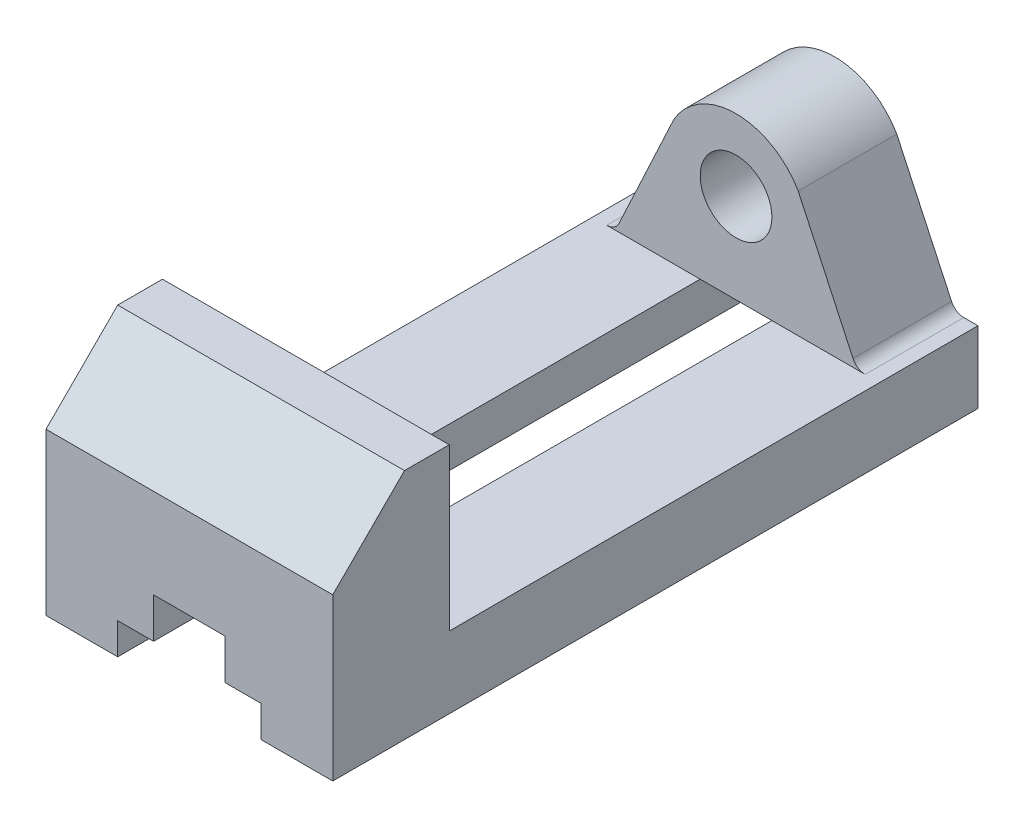
ISO-10303-21;
HEADER;
FILE_DESCRIPTION(('STEP AP214'),'2;1');
FILE_NAME('part.step','',(''),(''),'','','');
FILE_SCHEMA(('AUTOMOTIVE_DESIGN { 1 0 10303 214 1 1 1 1 }'));
ENDSEC;
DATA;
#1=APPLICATION_CONTEXT('core data for automotive mechanical design processes');
#2=APPLICATION_PROTOCOL_DEFINITION('international standard','automotive_design',2000,#1);
#3=PRODUCT_CONTEXT('',#1,'mechanical');
#4=PRODUCT('Part','Part','',(#3));
#5=PRODUCT_RELATED_PRODUCT_CATEGORY('part','',(#4));
#6=PRODUCT_DEFINITION_FORMATION('','',#4);
#7=PRODUCT_DEFINITION_CONTEXT('part definition',#1,'design');
#8=PRODUCT_DEFINITION('design','',#6,#7);
#9=PRODUCT_DEFINITION_SHAPE('','',#8);
#10=(LENGTH_UNIT() NAMED_UNIT(*) SI_UNIT(.MILLI.,.METRE.));
#11=(NAMED_UNIT(*) PLANE_ANGLE_UNIT() SI_UNIT($,.RADIAN.));
#12=(NAMED_UNIT(*) SI_UNIT($,.STERADIAN.) SOLID_ANGLE_UNIT());
#13=UNCERTAINTY_MEASURE_WITH_UNIT(LENGTH_MEASURE(1.E-05),#10,'distance_accuracy_value','');
#14=(GEOMETRIC_REPRESENTATION_CONTEXT(3) GLOBAL_UNCERTAINTY_ASSIGNED_CONTEXT((#13)) GLOBAL_UNIT_ASSIGNED_CONTEXT((#10,
#11,#12)) REPRESENTATION_CONTEXT('',''));
#15=CARTESIAN_POINT('',(0.,0.,0.));
#16=DIRECTION('',(0.,0.,1.));
#17=DIRECTION('',(1.,0.,0.));
#18=AXIS2_PLACEMENT_3D('',#15,#16,#17);
#19=CARTESIAN_POINT('',(32.,16.,0.));
#20=DIRECTION('',(0.,-1.,0.));
#21=DIRECTION('',(0.,0.,-1.));
#22=AXIS2_PLACEMENT_3D('',#19,#20,#21);
#23=PLANE('',#22);
#24=DIRECTION('',(-1.,0.,0.));
#25=VECTOR('',#24,1.);
#26=CARTESIAN_POINT('',(32.,16.,0.));
#27=LINE('',#26,#25);
#28=CARTESIAN_POINT('',(32.,16.,0.));
#29=VERTEX_POINT('',#28);
#30=CARTESIAN_POINT('',(28.8269173255336,16.,1.11022302462516E-13));
#31=VERTEX_POINT('',#30);
#32=EDGE_CURVE('E469',#29,#31,#27,.T.);
#33=ORIENTED_EDGE('',*,*,#32,.T.);
#34=DIRECTION('',(0.,0.,-1.));
#35=VECTOR('',#34,1.);
#36=CARTESIAN_POINT('',(28.8269173255336,16.,22.));
#37=LINE('',#36,#35);
#38=CARTESIAN_POINT('',(28.8269173255336,16.,22.));
#39=VERTEX_POINT('',#38);
#40=EDGE_CURVE('E489',#31,#39,#37,.F.);
#41=ORIENTED_EDGE('',*,*,#40,.T.);
#42=DIRECTION('',(1.,0.,0.));
#43=VECTOR('',#42,1.);
#44=CARTESIAN_POINT('',(26.9157065431111,16.,22.));
#45=LINE('',#44,#43);
#46=CARTESIAN_POINT('',(8.00000000000001,16.,22.));
#47=VERTEX_POINT('',#46);
#48=EDGE_CURVE('E64',#47,#39,#45,.T.);
#49=ORIENTED_EDGE('',*,*,#48,.F.);
#50=DIRECTION('',(0.,0.,-1.));
#51=VECTOR('',#50,1.);
#52=CARTESIAN_POINT('',(7.99999999999979,16.,144.));
#53=LINE('',#52,#51);
#54=CARTESIAN_POINT('',(7.99999999999979,16.,118.));
#55=VERTEX_POINT('',#54);
#56=EDGE_CURVE('E301',#55,#47,#53,.T.);
#57=ORIENTED_EDGE('',*,*,#56,.F.);
#58=DIRECTION('',(-1.,0.,0.));
#59=VECTOR('',#58,1.);
#60=CARTESIAN_POINT('',(31.9999999999998,16.,118.));
#61=LINE('',#60,#59);
#62=CARTESIAN_POINT('',(31.9999999999998,16.,118.));
#63=VERTEX_POINT('',#62);
#64=EDGE_CURVE('E462',#63,#55,#61,.T.);
#65=ORIENTED_EDGE('',*,*,#64,.F.);
#66=DIRECTION('',(0.,0.,1.));
#67=VECTOR('',#66,1.);
#68=CARTESIAN_POINT('',(32.,16.,0.));
#69=LINE('',#68,#67);
#70=EDGE_CURVE('E399',#29,#63,#69,.T.);
#71=ORIENTED_EDGE('',*,*,#70,.F.);
#72=EDGE_LOOP('',(#33,#41,#49,#57,#65,#71));
#73=FACE_BOUND('',#72,.T.);
#74=ADVANCED_FACE('F47',(#73),#23,.F.);
#75=CARTESIAN_POINT('',(32.,35.9999999999999,144.));
#76=DIRECTION('',(0.,0.,-1.));
#77=DIRECTION('',(-1.,0.,0.));
#78=AXIS2_PLACEMENT_3D('',#75,#76,#77);
#79=PLANE('',#78);
#80=DIRECTION('',(0.,-1.,0.));
#81=VECTOR('',#80,1.);
#82=CARTESIAN_POINT('',(-16.,0.,144.));
#83=LINE('',#82,#81);
#84=CARTESIAN_POINT('',(-16.,7.00000000000001,144.));
#85=VERTEX_POINT('',#84);
#86=CARTESIAN_POINT('',(-16.,0.,144.));
#87=VERTEX_POINT('',#86);
#88=EDGE_CURVE('E229',#85,#87,#83,.T.);
#89=ORIENTED_EDGE('',*,*,#88,.F.);
#90=DIRECTION('',(-1.,0.,0.));
#91=VECTOR('',#90,1.);
#92=CARTESIAN_POINT('',(-16.,7.00000000000001,144.));
#93=LINE('',#92,#91);
#94=CARTESIAN_POINT('',(-8.00000000000001,7.00000000000001,144.));
#95=VERTEX_POINT('',#94);
#96=EDGE_CURVE('E259',#95,#85,#93,.T.);
#97=ORIENTED_EDGE('',*,*,#96,.F.);
#98=DIRECTION('',(0.,-1.,0.));
#99=VECTOR('',#98,1.);
#100=CARTESIAN_POINT('',(-8.00000000000001,7.00000000000001,144.));
#101=LINE('',#100,#99);
#102=CARTESIAN_POINT('',(-8.00000000000001,16.,144.));
#103=VERTEX_POINT('',#102);
#104=EDGE_CURVE('E258',#103,#95,#101,.T.);
#105=ORIENTED_EDGE('',*,*,#104,.F.);
#106=DIRECTION('',(-1.,0.,0.));
#107=VECTOR('',#106,1.);
#108=CARTESIAN_POINT('',(-8.00000000000001,16.,144.));
#109=LINE('',#108,#107);
#110=CARTESIAN_POINT('',(7.99999999999979,16.,144.));
#111=VERTEX_POINT('',#110);
#112=EDGE_CURVE('E249',#111,#103,#109,.T.);
#113=ORIENTED_EDGE('',*,*,#112,.F.);
#114=DIRECTION('',(0.,1.,0.));
#115=VECTOR('',#114,1.);
#116=CARTESIAN_POINT('',(8.00000000000001,7.00000000000001,144.));
#117=LINE('',#116,#115);
#118=CARTESIAN_POINT('',(8.00000000000001,7.00000000000001,144.));
#119=VERTEX_POINT('',#118);
#120=EDGE_CURVE('E242',#119,#111,#117,.T.);
#121=ORIENTED_EDGE('',*,*,#120,.F.);
#122=DIRECTION('',(-1.,0.,0.));
#123=VECTOR('',#122,1.);
#124=CARTESIAN_POINT('',(16.,7.00000000000012,144.));
#125=LINE('',#124,#123);
#126=CARTESIAN_POINT('',(16.,7.00000000000012,144.));
#127=VERTEX_POINT('',#126);
#128=EDGE_CURVE('E226',#127,#119,#125,.T.);
#129=ORIENTED_EDGE('',*,*,#128,.F.);
#130=DIRECTION('',(0.,1.,0.));
#131=VECTOR('',#130,1.);
#132=CARTESIAN_POINT('',(16.,-2.33390205725048,144.));
#133=LINE('',#132,#131);
#134=CARTESIAN_POINT('',(16.,0.,144.));
#135=VERTEX_POINT('',#134);
#136=EDGE_CURVE('E216',#135,#127,#133,.T.);
#137=ORIENTED_EDGE('',*,*,#136,.F.);
#138=DIRECTION('',(-1.,0.,0.));
#139=VECTOR('',#138,1.);
#140=CARTESIAN_POINT('',(32.,0.,144.));
#141=LINE('',#140,#139);
#142=CARTESIAN_POINT('',(32.,0.,144.));
#143=VERTEX_POINT('',#142);
#144=EDGE_CURVE('E449',#143,#135,#141,.T.);
#145=ORIENTED_EDGE('',*,*,#144,.F.);
#146=DIRECTION('',(0.,-1.,0.));
#147=VECTOR('',#146,1.);
#148=CARTESIAN_POINT('',(32.,35.9999999999999,144.));
#149=LINE('',#148,#147);
#150=CARTESIAN_POINT('',(32.,35.9999999999999,144.));
#151=VERTEX_POINT('',#150);
#152=EDGE_CURVE('E411',#151,#143,#149,.T.);
#153=ORIENTED_EDGE('',*,*,#152,.F.);
#154=DIRECTION('',(-1.,0.,0.));
#155=VECTOR('',#154,1.);
#156=CARTESIAN_POINT('',(32.,35.9999999999999,144.));
#157=LINE('',#156,#155);
#158=CARTESIAN_POINT('',(-32.,35.9999999999999,144.));
#159=VERTEX_POINT('',#158);
#160=EDGE_CURVE('E455',#151,#159,#157,.T.);
#161=ORIENTED_EDGE('',*,*,#160,.T.);
#162=DIRECTION('',(0.,-1.,0.));
#163=VECTOR('',#162,1.);
#164=CARTESIAN_POINT('',(-32.,35.9999999999999,144.));
#165=LINE('',#164,#163);
#166=CARTESIAN_POINT('',(-32.,0.,144.));
#167=VERTEX_POINT('',#166);
#168=EDGE_CURVE('E440',#159,#167,#165,.T.);
#169=ORIENTED_EDGE('',*,*,#168,.T.);
#170=EDGE_CURVE('E446',#87,#167,#141,.T.);
#171=ORIENTED_EDGE('',*,*,#170,.F.);
#172=EDGE_LOOP('',(#89,#97,#105,#113,#121,#129,#137,#145,#153,#161,#169,#171));
#173=FACE_BOUND('',#172,.T.);
#174=ADVANCED_FACE('F241',(#173),#79,.F.);
#175=CARTESIAN_POINT('',(32.,0.,0.));
#176=DIRECTION('',(0.,-1.,0.));
#177=DIRECTION('',(0.,0.,-1.));
#178=AXIS2_PLACEMENT_3D('',#175,#176,#177);
#179=PLANE('',#178);
#180=CARTESIAN_POINT('',(22.,0.,108.));
#181=DIRECTION('',(0.,-1.,0.));
#182=DIRECTION('',(0.,0.,-1.));
#183=AXIS2_PLACEMENT_3D('',#180,#181,#182);
#184=CIRCLE('',#183,3.025);
#185=CARTESIAN_POINT('',(22.,0.,104.975));
#186=VERTEX_POINT('',#185);
#187=EDGE_CURVE('E317',#186,#186,#184,.T.);
#188=ORIENTED_EDGE('',*,*,#187,.F.);
#189=EDGE_LOOP('',(#188));
#190=FACE_BOUND('',#189,.T.);
#191=CARTESIAN_POINT('',(22.,0.,38.));
#192=DIRECTION('',(0.,-1.,0.));
#193=DIRECTION('',(0.,0.,-1.));
#194=AXIS2_PLACEMENT_3D('',#191,#192,#193);
#195=CIRCLE('',#194,3.025);
#196=CARTESIAN_POINT('',(22.,0.,34.975));
#197=VERTEX_POINT('',#196);
#198=EDGE_CURVE('E332',#197,#197,#195,.T.);
#199=ORIENTED_EDGE('',*,*,#198,.F.);
#200=EDGE_LOOP('',(#199));
#201=FACE_BOUND('',#200,.T.);
#202=ORIENTED_EDGE('',*,*,#144,.T.);
#203=DIRECTION('',(0.,0.,-1.));
#204=VECTOR('',#203,1.);
#205=CARTESIAN_POINT('',(16.,0.,0.));
#206=LINE('',#205,#204);
#207=CARTESIAN_POINT('',(16.,0.,0.));
#208=VERTEX_POINT('',#207);
#209=EDGE_CURVE('E225',#135,#208,#206,.T.);
#210=ORIENTED_EDGE('',*,*,#209,.T.);
#211=DIRECTION('',(-1.,0.,0.));
#212=VECTOR('',#211,1.);
#213=CARTESIAN_POINT('',(32.,0.,0.));
#214=LINE('',#213,#212);
#215=CARTESIAN_POINT('',(32.,0.,0.));
#216=VERTEX_POINT('',#215);
#217=EDGE_CURVE('E441',#216,#208,#214,.T.);
#218=ORIENTED_EDGE('',*,*,#217,.F.);
#219=DIRECTION('',(0.,0.,1.));
#220=VECTOR('',#219,1.);
#221=CARTESIAN_POINT('',(32.,0.,0.));
#222=LINE('',#221,#220);
#223=EDGE_CURVE('E418',#216,#143,#222,.T.);
#224=ORIENTED_EDGE('',*,*,#223,.T.);
#225=EDGE_LOOP('',(#202,#210,#218,#224));
#226=FACE_BOUND('',#225,.T.);
#227=ADVANCED_FACE('F660',(#190,#201,#226),#179,.T.);
#228=CARTESIAN_POINT('',(-22.,0.,38.));
#229=DIRECTION('',(0.,-1.,0.));
#230=DIRECTION('',(0.,0.,-1.));
#231=AXIS2_PLACEMENT_3D('',#228,#229,#230);
#232=CIRCLE('',#231,3.025);
#233=CARTESIAN_POINT('',(-22.,0.,34.975));
#234=VERTEX_POINT('',#233);
#235=EDGE_CURVE('E341',#234,#234,#232,.T.);
#236=ORIENTED_EDGE('',*,*,#235,.F.);
#237=EDGE_LOOP('',(#236));
#238=FACE_BOUND('',#237,.T.);
#239=CARTESIAN_POINT('',(-22.,0.,108.));
#240=DIRECTION('',(0.,-1.,0.));
#241=DIRECTION('',(0.,0.,-1.));
#242=AXIS2_PLACEMENT_3D('',#239,#240,#241);
#243=CIRCLE('',#242,3.025);
#244=CARTESIAN_POINT('',(-22.,0.,104.975));
#245=VERTEX_POINT('',#244);
#246=EDGE_CURVE('E308',#245,#245,#243,.T.);
#247=ORIENTED_EDGE('',*,*,#246,.F.);
#248=EDGE_LOOP('',(#247));
#249=FACE_BOUND('',#248,.T.);
#250=CARTESIAN_POINT('',(-16.,0.,1.22124532708767E-12));
#251=VERTEX_POINT('',#250);
#252=CARTESIAN_POINT('',(-32.,0.,0.));
#253=VERTEX_POINT('',#252);
#254=EDGE_CURVE('E419',#251,#253,#214,.T.);
#255=ORIENTED_EDGE('',*,*,#254,.F.);
#256=DIRECTION('',(0.,0.,1.));
#257=VECTOR('',#256,1.);
#258=CARTESIAN_POINT('',(-16.,0.,1.22124532708767E-12));
#259=LINE('',#258,#257);
#260=EDGE_CURVE('E471',#251,#87,#259,.T.);
#261=ORIENTED_EDGE('',*,*,#260,.T.);
#262=ORIENTED_EDGE('',*,*,#170,.T.);
#263=DIRECTION('',(0.,0.,1.));
#264=VECTOR('',#263,1.);
#265=CARTESIAN_POINT('',(-32.,0.,0.));
#266=LINE('',#265,#264);
#267=EDGE_CURVE('E402',#253,#167,#266,.T.);
#268=ORIENTED_EDGE('',*,*,#267,.F.);
#269=EDGE_LOOP('',(#255,#261,#262,#268));
#270=FACE_BOUND('',#269,.T.);
#271=ADVANCED_FACE('F635',(#238,#249,#270),#179,.T.);
#272=CARTESIAN_POINT('',(-28.8269173255336,16.,22.));
#273=VERTEX_POINT('',#272);
#274=CARTESIAN_POINT('',(-8.00000000000001,16.,22.));
#275=VERTEX_POINT('',#274);
#276=EDGE_CURVE('E365',#273,#275,#45,.T.);
#277=ORIENTED_EDGE('',*,*,#276,.F.);
#278=DIRECTION('',(0.,0.,-1.));
#279=VECTOR('',#278,1.);
#280=CARTESIAN_POINT('',(-28.8269173255336,16.,0.));
#281=LINE('',#280,#279);
#282=CARTESIAN_POINT('',(-28.8269173255336,16.,0.));
#283=VERTEX_POINT('',#282);
#284=EDGE_CURVE('E479',#273,#283,#281,.T.);
#285=ORIENTED_EDGE('',*,*,#284,.T.);
#286=CARTESIAN_POINT('',(-32.,16.,1.11022302462516E-13));
#287=VERTEX_POINT('',#286);
#288=EDGE_CURVE('E467',#283,#287,#27,.T.);
#289=ORIENTED_EDGE('',*,*,#288,.T.);
#290=DIRECTION('',(0.,0.,1.));
#291=VECTOR('',#290,1.);
#292=CARTESIAN_POINT('',(-32.,16.,1.11022302462516E-13));
#293=LINE('',#292,#291);
#294=CARTESIAN_POINT('',(-32.,16.,118.));
#295=VERTEX_POINT('',#294);
#296=EDGE_CURVE('E424',#287,#295,#293,.T.);
#297=ORIENTED_EDGE('',*,*,#296,.T.);
#298=CARTESIAN_POINT('',(-8.00000000000001,16.,118.));
#299=VERTEX_POINT('',#298);
#300=EDGE_CURVE('E464',#299,#295,#61,.T.);
#301=ORIENTED_EDGE('',*,*,#300,.F.);
#302=DIRECTION('',(0.,0.,-1.));
#303=VECTOR('',#302,1.);
#304=CARTESIAN_POINT('',(-8.00000000000001,16.,144.));
#305=LINE('',#304,#303);
#306=EDGE_CURVE('E299',#299,#275,#305,.T.);
#307=ORIENTED_EDGE('',*,*,#306,.T.);
#308=EDGE_LOOP('',(#277,#285,#289,#297,#301,#307));
#309=FACE_BOUND('',#308,.T.);
#310=ADVANCED_FACE('F612',(#309),#23,.F.);
#311=CARTESIAN_POINT('',(32.,0.,0.));
#312=DIRECTION('',(0.,0.,1.));
#313=DIRECTION('',(0.,-1.,0.));
#314=AXIS2_PLACEMENT_3D('',#311,#312,#313);
#315=PLANE('',#314);
#316=DIRECTION('',(-1.,0.,0.));
#317=VECTOR('',#316,1.);
#318=CARTESIAN_POINT('',(-16.,7.00000000000001,0.));
#319=LINE('',#318,#317);
#320=CARTESIAN_POINT('',(-8.00000000000001,7.00000000000001,0.));
#321=VERTEX_POINT('',#320);
#322=CARTESIAN_POINT('',(-16.,7.00000000000001,0.));
#323=VERTEX_POINT('',#322);
#324=EDGE_CURVE('E278',#321,#323,#319,.T.);
#325=ORIENTED_EDGE('',*,*,#324,.T.);
#326=DIRECTION('',(0.,-1.,0.));
#327=VECTOR('',#326,1.);
#328=CARTESIAN_POINT('',(-16.,0.,1.22124532708767E-12));
#329=LINE('',#328,#327);
#330=EDGE_CURVE('E284',#323,#251,#329,.T.);
#331=ORIENTED_EDGE('',*,*,#330,.T.);
#332=ORIENTED_EDGE('',*,*,#254,.T.);
#333=DIRECTION('',(0.,1.,0.));
#334=VECTOR('',#333,1.);
#335=CARTESIAN_POINT('',(-32.,0.,0.));
#336=LINE('',#335,#334);
#337=EDGE_CURVE('E392',#253,#287,#336,.T.);
#338=ORIENTED_EDGE('',*,*,#337,.T.);
#339=ORIENTED_EDGE('',*,*,#288,.F.);
#340=CARTESIAN_POINT('',(-28.8269173255336,19.,-1.11022302462516E-12));
#341=DIRECTION('',(0.,0.,1.));
#342=DIRECTION('',(0.,-1.,0.));
#343=AXIS2_PLACEMENT_3D('',#340,#341,#342);
#344=CIRCLE('',#343,3.);
#345=CARTESIAN_POINT('',(-26.1079939644238,17.732145214778,0.));
#346=VERTEX_POINT('',#345);
#347=EDGE_CURVE('E492',#283,#346,#344,.T.);
#348=ORIENTED_EDGE('',*,*,#347,.T.);
#349=DIRECTION('',(-0.422618261740697,-0.906307787036651,0.));
#350=VECTOR('',#349,1.);
#351=CARTESIAN_POINT('',(-26.9157065431111,16.,1.22124532708767E-12));
#352=LINE('',#351,#350);
#353=CARTESIAN_POINT('',(-13.8704907411777,43.9755555667869,0.));
#354=VERTEX_POINT('',#353);
#355=EDGE_CURVE('E383',#354,#346,#352,.T.);
#356=ORIENTED_EDGE('',*,*,#355,.F.);
#357=CARTESIAN_POINT('',(0.,36.,0.));
#358=DIRECTION('',(0.,0.,1.));
#359=DIRECTION('',(1.,0.,0.));
#360=AXIS2_PLACEMENT_3D('',#357,#358,#359);
#361=CIRCLE('',#360,16.0000000000001);
#362=CARTESIAN_POINT('',(13.8704907411775,43.975555566787,-1.22124532708767E-12));
#363=VERTEX_POINT('',#362);
#364=EDGE_CURVE('E381',#363,#354,#361,.T.);
#365=ORIENTED_EDGE('',*,*,#364,.F.);
#366=DIRECTION('',(-0.422618261740701,0.906307787036649,0.));
#367=VECTOR('',#366,1.);
#368=CARTESIAN_POINT('',(26.9157065431111,16.,0.));
#369=LINE('',#368,#367);
#370=CARTESIAN_POINT('',(26.1079939644235,17.732145214778,0.));
#371=VERTEX_POINT('',#370);
#372=EDGE_CURVE('E359',#371,#363,#369,.T.);
#373=ORIENTED_EDGE('',*,*,#372,.F.);
#374=CARTESIAN_POINT('',(28.8269173255336,19.,0.));
#375=DIRECTION('',(0.,0.,1.));
#376=DIRECTION('',(0.,-1.,0.));
#377=AXIS2_PLACEMENT_3D('',#374,#375,#376);
#378=CIRCLE('',#377,3.);
#379=EDGE_CURVE('E59',#371,#31,#378,.T.);
#380=ORIENTED_EDGE('',*,*,#379,.T.);
#381=ORIENTED_EDGE('',*,*,#32,.F.);
#382=DIRECTION('',(0.,1.,0.));
#383=VECTOR('',#382,1.);
#384=CARTESIAN_POINT('',(32.,0.,0.));
#385=LINE('',#384,#383);
#386=EDGE_CURVE('E398',#216,#29,#385,.T.);
#387=ORIENTED_EDGE('',*,*,#386,.F.);
#388=ORIENTED_EDGE('',*,*,#217,.T.);
#389=DIRECTION('',(0.,1.,0.));
#390=VECTOR('',#389,1.);
#391=CARTESIAN_POINT('',(16.,1.11022302462516E-13,0.));
#392=LINE('',#391,#390);
#393=CARTESIAN_POINT('',(16.,7.00000000000012,0.));
#394=VERTEX_POINT('',#393);
#395=EDGE_CURVE('E263',#208,#394,#392,.T.);
#396=ORIENTED_EDGE('',*,*,#395,.T.);
#397=DIRECTION('',(-1.,0.,0.));
#398=VECTOR('',#397,1.);
#399=CARTESIAN_POINT('',(16.,7.00000000000012,0.));
#400=LINE('',#399,#398);
#401=CARTESIAN_POINT('',(8.00000000000001,7.00000000000001,0.));
#402=VERTEX_POINT('',#401);
#403=EDGE_CURVE('E234',#394,#402,#400,.T.);
#404=ORIENTED_EDGE('',*,*,#403,.T.);
#405=DIRECTION('',(0.,1.,0.));
#406=VECTOR('',#405,1.);
#407=CARTESIAN_POINT('',(8.00000000000001,7.00000000000001,0.));
#408=LINE('',#407,#406);
#409=CARTESIAN_POINT('',(7.99999999999979,16.,0.));
#410=VERTEX_POINT('',#409);
#411=EDGE_CURVE('E268',#402,#410,#408,.T.);
#412=ORIENTED_EDGE('',*,*,#411,.T.);
#413=DIRECTION('',(-1.,0.,0.));
#414=VECTOR('',#413,1.);
#415=CARTESIAN_POINT('',(-8.00000000000001,16.,0.));
#416=LINE('',#415,#414);
#417=CARTESIAN_POINT('',(-8.00000000000001,16.,0.));
#418=VERTEX_POINT('',#417);
#419=EDGE_CURVE('E275',#410,#418,#416,.T.);
#420=ORIENTED_EDGE('',*,*,#419,.T.);
#421=DIRECTION('',(0.,-1.,0.));
#422=VECTOR('',#421,1.);
#423=CARTESIAN_POINT('',(-8.00000000000001,7.00000000000001,0.));
#424=LINE('',#423,#422);
#425=EDGE_CURVE('E277',#418,#321,#424,.T.);
#426=ORIENTED_EDGE('',*,*,#425,.T.);
#427=EDGE_LOOP('',(#325,#331,#332,#338,#339,#348,#356,#365,#373,#380,#381,#387,#388,#396,#404,
#412,#420,#426));
#428=FACE_BOUND('',#427,.T.);
#429=CARTESIAN_POINT('',(0.,36.,0.));
#430=DIRECTION('',(0.,0.,1.));
#431=DIRECTION('',(1.,0.,0.));
#432=AXIS2_PLACEMENT_3D('',#429,#430,#431);
#433=CIRCLE('',#432,8.);
#434=CARTESIAN_POINT('',(8.,36.,0.));
#435=VERTEX_POINT('',#434);
#436=EDGE_CURVE('E352',#435,#435,#433,.T.);
#437=ORIENTED_EDGE('',*,*,#436,.T.);
#438=EDGE_LOOP('',(#437));
#439=FACE_BOUND('',#438,.T.);
#440=ADVANCED_FACE('F598',(#428,#439),#315,.F.);
#441=CARTESIAN_POINT('',(31.9999999999998,16.,118.));
#442=DIRECTION('',(0.,0.,1.));
#443=DIRECTION('',(0.,-1.,0.));
#444=AXIS2_PLACEMENT_3D('',#441,#442,#443);
#445=PLANE('',#444);
#446=DIRECTION('',(0.,1.,0.));
#447=VECTOR('',#446,1.);
#448=CARTESIAN_POINT('',(-32.,16.,118.));
#449=LINE('',#448,#447);
#450=CARTESIAN_POINT('',(-32.,52.,118.));
#451=VERTEX_POINT('',#450);
#452=EDGE_CURVE('E428',#295,#451,#449,.T.);
#453=ORIENTED_EDGE('',*,*,#452,.T.);
#454=DIRECTION('',(-1.,0.,0.));
#455=VECTOR('',#454,1.);
#456=CARTESIAN_POINT('',(31.9999999999998,52.,118.));
#457=LINE('',#456,#455);
#458=CARTESIAN_POINT('',(31.9999999999998,52.,118.));
#459=VERTEX_POINT('',#458);
#460=EDGE_CURVE('E458',#459,#451,#457,.T.);
#461=ORIENTED_EDGE('',*,*,#460,.F.);
#462=DIRECTION('',(0.,1.,0.));
#463=VECTOR('',#462,1.);
#464=CARTESIAN_POINT('',(31.9999999999998,16.,118.));
#465=LINE('',#464,#463);
#466=EDGE_CURVE('E404',#63,#459,#465,.T.);
#467=ORIENTED_EDGE('',*,*,#466,.F.);
#468=ORIENTED_EDGE('',*,*,#64,.T.);
#469=EDGE_CURVE('E236',#55,#299,#61,.T.);
#470=ORIENTED_EDGE('',*,*,#469,.T.);
#471=ORIENTED_EDGE('',*,*,#300,.T.);
#472=EDGE_LOOP('',(#453,#461,#467,#468,#470,#471));
#473=FACE_BOUND('',#472,.T.);
#474=ADVANCED_FACE('F644',(#473),#445,.F.);
#475=CARTESIAN_POINT('',(31.9999999999998,52.,118.));
#476=DIRECTION('',(0.,-1.,0.));
#477=DIRECTION('',(0.,0.,-1.));
#478=AXIS2_PLACEMENT_3D('',#475,#476,#477);
#479=PLANE('',#478);
#480=DIRECTION('',(0.,0.,1.));
#481=VECTOR('',#480,1.);
#482=CARTESIAN_POINT('',(-32.,52.,118.));
#483=LINE('',#482,#481);
#484=CARTESIAN_POINT('',(-32.,51.9999999999999,128.));
#485=VERTEX_POINT('',#484);
#486=EDGE_CURVE('E431',#451,#485,#483,.T.);
#487=ORIENTED_EDGE('',*,*,#486,.T.);
#488=DIRECTION('',(-1.,0.,0.));
#489=VECTOR('',#488,1.);
#490=CARTESIAN_POINT('',(32.,51.9999999999999,128.));
#491=LINE('',#490,#489);
#492=CARTESIAN_POINT('',(32.,51.9999999999999,128.));
#493=VERTEX_POINT('',#492);
#494=EDGE_CURVE('E457',#493,#485,#491,.T.);
#495=ORIENTED_EDGE('',*,*,#494,.F.);
#496=DIRECTION('',(0.,0.,1.));
#497=VECTOR('',#496,1.);
#498=CARTESIAN_POINT('',(31.9999999999998,52.,118.));
#499=LINE('',#498,#497);
#500=EDGE_CURVE('E410',#459,#493,#499,.T.);
#501=ORIENTED_EDGE('',*,*,#500,.F.);
#502=ORIENTED_EDGE('',*,*,#460,.T.);
#503=EDGE_LOOP('',(#487,#495,#501,#502));
#504=FACE_BOUND('',#503,.T.);
#505=ADVANCED_FACE('F648',(#504),#479,.F.);
#506=CARTESIAN_POINT('',(32.,51.9999999999999,128.));
#507=DIRECTION('',(0.,-0.707106781186547,-0.707106781186548));
#508=DIRECTION('',(0.,0.707106781186548,-0.707106781186547));
#509=AXIS2_PLACEMENT_3D('',#506,#507,#508);
#510=PLANE('',#509);
#511=DIRECTION('',(0.,-0.707106781186548,0.707106781186547));
#512=VECTOR('',#511,1.);
#513=CARTESIAN_POINT('',(-32.,51.9999999999999,128.));
#514=LINE('',#513,#512);
#515=EDGE_CURVE('E432',#485,#159,#514,.T.);
#516=ORIENTED_EDGE('',*,*,#515,.T.);
#517=ORIENTED_EDGE('',*,*,#160,.F.);
#518=DIRECTION('',(0.,-0.707106781186548,0.707106781186547));
#519=VECTOR('',#518,1.);
#520=CARTESIAN_POINT('',(32.,51.9999999999999,128.));
#521=LINE('',#520,#519);
#522=EDGE_CURVE('E407',#493,#151,#521,.T.);
#523=ORIENTED_EDGE('',*,*,#522,.F.);
#524=ORIENTED_EDGE('',*,*,#494,.T.);
#525=EDGE_LOOP('',(#516,#517,#523,#524));
#526=FACE_BOUND('',#525,.T.);
#527=ADVANCED_FACE('F659',(#526),#510,.F.);
#528=CARTESIAN_POINT('',(32.,0.,0.));
#529=DIRECTION('',(1.,0.,0.));
#530=DIRECTION('',(0.,0.,-1.));
#531=AXIS2_PLACEMENT_3D('',#528,#529,#530);
#532=PLANE('',#531);
#533=ORIENTED_EDGE('',*,*,#386,.T.);
#534=ORIENTED_EDGE('',*,*,#70,.T.);
#535=ORIENTED_EDGE('',*,*,#466,.T.);
#536=ORIENTED_EDGE('',*,*,#500,.T.);
#537=ORIENTED_EDGE('',*,*,#522,.T.);
#538=ORIENTED_EDGE('',*,*,#152,.T.);
#539=ORIENTED_EDGE('',*,*,#223,.F.);
#540=EDGE_LOOP('',(#533,#534,#535,#536,#537,#538,#539));
#541=FACE_BOUND('',#540,.T.);
#542=ADVANCED_FACE('F655',(#541),#532,.T.);
#543=CARTESIAN_POINT('',(-32.,0.,0.));
#544=DIRECTION('',(1.,0.,0.));
#545=DIRECTION('',(0.,0.,-1.));
#546=AXIS2_PLACEMENT_3D('',#543,#544,#545);
#547=PLANE('',#546);
#548=ORIENTED_EDGE('',*,*,#337,.F.);
#549=ORIENTED_EDGE('',*,*,#267,.T.);
#550=ORIENTED_EDGE('',*,*,#168,.F.);
#551=ORIENTED_EDGE('',*,*,#515,.F.);
#552=ORIENTED_EDGE('',*,*,#486,.F.);
#553=ORIENTED_EDGE('',*,*,#452,.F.);
#554=ORIENTED_EDGE('',*,*,#296,.F.);
#555=EDGE_LOOP('',(#548,#549,#550,#551,#552,#553,#554));
#556=FACE_BOUND('',#555,.T.);
#557=ADVANCED_FACE('F638',(#556),#547,.F.);
#558=CARTESIAN_POINT('',(0.,36.,21.9999999999999));
#559=DIRECTION('',(0.,0.,1.));
#560=DIRECTION('',(1.,0.,0.));
#561=AXIS2_PLACEMENT_3D('',#558,#559,#560);
#562=PLANE('',#561);
#563=ORIENTED_EDGE('',*,*,#276,.T.);
#564=EDGE_CURVE('E313',#275,#47,#45,.T.);
#565=ORIENTED_EDGE('',*,*,#564,.T.);
#566=ORIENTED_EDGE('',*,*,#48,.T.);
#567=CARTESIAN_POINT('',(28.8269173255336,19.,21.9999999999999));
#568=DIRECTION('',(0.,0.,1.));
#569=DIRECTION('',(1.,0.,0.));
#570=AXIS2_PLACEMENT_3D('',#567,#568,#569);
#571=CIRCLE('',#570,3.);
#572=CARTESIAN_POINT('',(26.1079939644235,17.732145214778,22.));
#573=VERTEX_POINT('',#572);
#574=EDGE_CURVE('E11',#39,#573,#571,.F.);
#575=ORIENTED_EDGE('',*,*,#574,.T.);
#576=DIRECTION('',(-0.422618261740701,0.906307787036649,0.));
#577=VECTOR('',#576,1.);
#578=CARTESIAN_POINT('',(26.9157065431111,16.,22.));
#579=LINE('',#578,#577);
#580=CARTESIAN_POINT('',(13.8704907411775,43.975555566787,21.9999999999988));
#581=VERTEX_POINT('',#580);
#582=EDGE_CURVE('E366',#573,#581,#579,.T.);
#583=ORIENTED_EDGE('',*,*,#582,.T.);
#584=CARTESIAN_POINT('',(0.,36.,21.9999999999999));
#585=DIRECTION('',(0.,0.,1.));
#586=DIRECTION('',(1.,0.,0.));
#587=AXIS2_PLACEMENT_3D('',#584,#585,#586);
#588=CIRCLE('',#587,16.0000000000001);
#589=CARTESIAN_POINT('',(-13.8704907411777,43.9755555667869,22.));
#590=VERTEX_POINT('',#589);
#591=EDGE_CURVE('E371',#581,#590,#588,.T.);
#592=ORIENTED_EDGE('',*,*,#591,.T.);
#593=DIRECTION('',(-0.422618261740697,-0.906307787036651,0.));
#594=VECTOR('',#593,1.);
#595=CARTESIAN_POINT('',(-26.9157065431111,16.,22.0000000000011));
#596=LINE('',#595,#594);
#597=CARTESIAN_POINT('',(-26.1079939644235,17.732145214778,22.));
#598=VERTEX_POINT('',#597);
#599=EDGE_CURVE('E372',#590,#598,#596,.T.);
#600=ORIENTED_EDGE('',*,*,#599,.T.);
#601=CARTESIAN_POINT('',(-28.8269173255336,19.,21.9999999999988));
#602=DIRECTION('',(0.,0.,1.));
#603=DIRECTION('',(1.,0.,0.));
#604=AXIS2_PLACEMENT_3D('',#601,#602,#603);
#605=CIRCLE('',#604,3.);
#606=EDGE_CURVE('E497',#598,#273,#605,.F.);
#607=ORIENTED_EDGE('',*,*,#606,.T.);
#608=EDGE_LOOP('',(#563,#565,#566,#575,#583,#592,#600,#607));
#609=FACE_BOUND('',#608,.T.);
#610=CARTESIAN_POINT('',(0.,36.,21.9999999999999));
#611=DIRECTION('',(0.,0.,1.));
#612=DIRECTION('',(1.,0.,0.));
#613=AXIS2_PLACEMENT_3D('',#610,#611,#612);
#614=CIRCLE('',#613,8.);
#615=CARTESIAN_POINT('',(8.,36.,21.9999999999999));
#616=VERTEX_POINT('',#615);
#617=EDGE_CURVE('E358',#616,#616,#614,.T.);
#618=ORIENTED_EDGE('',*,*,#617,.F.);
#619=EDGE_LOOP('',(#618));
#620=FACE_BOUND('',#619,.T.);
#621=ADVANCED_FACE('F608',(#609,#620),#562,.T.);
#622=CARTESIAN_POINT('',(26.9157065431111,16.,22.));
#623=DIRECTION('',(-0.906307787036649,-0.422618261740701,0.));
#624=DIRECTION('',(0.422618261740701,-0.906307787036649,0.));
#625=AXIS2_PLACEMENT_3D('',#622,#623,#624);
#626=PLANE('',#625);
#627=ORIENTED_EDGE('',*,*,#582,.F.);
#628=DIRECTION('',(0.,0.,-1.));
#629=VECTOR('',#628,1.);
#630=CARTESIAN_POINT('',(26.1079939644235,17.732145214778,0.));
#631=LINE('',#630,#629);
#632=EDGE_CURVE('E486',#573,#371,#631,.T.);
#633=ORIENTED_EDGE('',*,*,#632,.T.);
#634=ORIENTED_EDGE('',*,*,#372,.T.);
#635=DIRECTION('',(0.,0.,-1.));
#636=VECTOR('',#635,1.);
#637=CARTESIAN_POINT('',(13.8704907411775,43.975555566787,21.9999999999988));
#638=LINE('',#637,#636);
#639=EDGE_CURVE('E393',#581,#363,#638,.T.);
#640=ORIENTED_EDGE('',*,*,#639,.F.);
#641=EDGE_LOOP('',(#627,#633,#634,#640));
#642=FACE_BOUND('',#641,.T.);
#643=ADVANCED_FACE('F697',(#642),#626,.F.);
#644=CARTESIAN_POINT('',(0.,36.,21.9999999999999));
#645=DIRECTION('',(0.,0.,-1.));
#646=DIRECTION('',(-1.,0.,0.));
#647=AXIS2_PLACEMENT_3D('',#644,#645,#646);
#648=CYLINDRICAL_SURFACE('',#647,16.0000000000001);
#649=ORIENTED_EDGE('',*,*,#364,.T.);
#650=DIRECTION('',(0.,0.,-1.));
#651=VECTOR('',#650,1.);
#652=CARTESIAN_POINT('',(-13.8704907411777,43.9755555667869,22.));
#653=LINE('',#652,#651);
#654=EDGE_CURVE('E378',#590,#354,#653,.T.);
#655=ORIENTED_EDGE('',*,*,#654,.F.);
#656=ORIENTED_EDGE('',*,*,#591,.F.);
#657=ORIENTED_EDGE('',*,*,#639,.T.);
#658=EDGE_LOOP('',(#649,#655,#656,#657));
#659=FACE_BOUND('',#658,.T.);
#660=ADVANCED_FACE('F703',(#659),#648,.T.);
#661=CARTESIAN_POINT('',(-26.9157065431111,16.,22.0000000000011));
#662=DIRECTION('',(0.906307787036651,-0.422618261740697,0.));
#663=DIRECTION('',(0.422618261740697,0.906307787036651,0.));
#664=AXIS2_PLACEMENT_3D('',#661,#662,#663);
#665=PLANE('',#664);
#666=ORIENTED_EDGE('',*,*,#355,.T.);
#667=DIRECTION('',(0.,0.,-1.));
#668=VECTOR('',#667,1.);
#669=CARTESIAN_POINT('',(-26.1079939644235,17.732145214778,22.));
#670=LINE('',#669,#668);
#671=EDGE_CURVE('E483',#346,#598,#670,.F.);
#672=ORIENTED_EDGE('',*,*,#671,.T.);
#673=ORIENTED_EDGE('',*,*,#599,.F.);
#674=ORIENTED_EDGE('',*,*,#654,.T.);
#675=EDGE_LOOP('',(#666,#672,#673,#674));
#676=FACE_BOUND('',#675,.T.);
#677=ADVANCED_FACE('F710',(#676),#665,.F.);
#678=CARTESIAN_POINT('',(0.,36.,21.9999999999999));
#679=DIRECTION('',(0.,0.,-1.));
#680=DIRECTION('',(-1.,0.,0.));
#681=AXIS2_PLACEMENT_3D('',#678,#679,#680);
#682=CYLINDRICAL_SURFACE('',#681,8.);
#683=ORIENTED_EDGE('',*,*,#617,.T.);
#684=EDGE_LOOP('',(#683));
#685=FACE_BOUND('',#684,.T.);
#686=ORIENTED_EDGE('',*,*,#436,.F.);
#687=EDGE_LOOP('',(#686));
#688=FACE_BOUND('',#687,.T.);
#689=ADVANCED_FACE('F711',(#685,#688),#682,.F.);
#690=CARTESIAN_POINT('',(-22.,10.,37.9999999999988));
#691=DIRECTION('',(0.,-1.,0.));
#692=DIRECTION('',(0.,0.,-1.));
#693=AXIS2_PLACEMENT_3D('',#690,#691,#692);
#694=CONICAL_SURFACE('',#693,2.49999999999999,1.02974425867665);
#695=CARTESIAN_POINT('',(-22.,11.5021515475689,37.9999999999999));
#696=VERTEX_POINT('',#695);
#697=VERTEX_LOOP('',#696);
#698=FACE_BOUND('',#697,.T.);
#699=CARTESIAN_POINT('',(-22.,10.,37.9999999999988));
#700=DIRECTION('',(0.,-1.,0.));
#701=DIRECTION('',(0.,0.,-1.));
#702=AXIS2_PLACEMENT_3D('',#699,#700,#701);
#703=CIRCLE('',#702,2.49999999999999);
#704=CARTESIAN_POINT('',(-22.,10.,35.4999999999988));
#705=VERTEX_POINT('',#704);
#706=EDGE_CURVE('E353',#705,#705,#703,.T.);
#707=ORIENTED_EDGE('',*,*,#706,.T.);
#708=EDGE_LOOP('',(#707));
#709=FACE_BOUND('',#708,.T.);
#710=ADVANCED_FACE('F720',(#698,#709),#694,.F.);
#711=CARTESIAN_POINT('',(-22.,0.,38.));
#712=DIRECTION('',(0.,-1.,0.));
#713=DIRECTION('',(0.,0.,-1.));
#714=AXIS2_PLACEMENT_3D('',#711,#712,#713);
#715=CYLINDRICAL_SURFACE('',#714,2.49999999999999);
#716=ORIENTED_EDGE('',*,*,#706,.F.);
#717=EDGE_LOOP('',(#716));
#718=FACE_BOUND('',#717,.T.);
#719=CARTESIAN_POINT('',(-22.,0.440527306368121,38.));
#720=DIRECTION('',(0.,-1.,0.));
#721=DIRECTION('',(0.,0.,-1.));
#722=AXIS2_PLACEMENT_3D('',#719,#720,#721);
#723=CIRCLE('',#722,2.49999999999999);
#724=CARTESIAN_POINT('',(-22.,0.440527306368121,35.5));
#725=VERTEX_POINT('',#724);
#726=EDGE_CURVE('E350',#725,#725,#723,.T.);
#727=ORIENTED_EDGE('',*,*,#726,.T.);
#728=EDGE_LOOP('',(#727));
#729=FACE_BOUND('',#728,.T.);
#730=ADVANCED_FACE('F723',(#718,#729),#715,.F.);
#731=CARTESIAN_POINT('',(-22.,0.,38.));
#732=DIRECTION('',(0.,-1.,0.));
#733=DIRECTION('',(0.,0.,-1.));
#734=AXIS2_PLACEMENT_3D('',#731,#732,#733);
#735=CONICAL_SURFACE('',#734,3.025,0.872664625997181);
#736=ORIENTED_EDGE('',*,*,#726,.F.);
#737=EDGE_LOOP('',(#736));
#738=FACE_BOUND('',#737,.T.);
#739=ORIENTED_EDGE('',*,*,#235,.T.);
#740=EDGE_LOOP('',(#739));
#741=FACE_BOUND('',#740,.T.);
#742=ADVANCED_FACE('F722',(#738,#741),#735,.F.);
#743=CARTESIAN_POINT('',(22.,10.,37.9999999999988));
#744=DIRECTION('',(0.,-1.,0.));
#745=DIRECTION('',(0.,0.,-1.));
#746=AXIS2_PLACEMENT_3D('',#743,#744,#745);
#747=CONICAL_SURFACE('',#746,2.49999999999999,1.02974425867665);
#748=CARTESIAN_POINT('',(22.,11.5021515475689,37.9999999999988));
#749=VERTEX_POINT('',#748);
#750=VERTEX_LOOP('',#749);
#751=FACE_BOUND('',#750,.T.);
#752=CARTESIAN_POINT('',(22.,10.,37.9999999999988));
#753=DIRECTION('',(0.,-1.,0.));
#754=DIRECTION('',(0.,0.,-1.));
#755=AXIS2_PLACEMENT_3D('',#752,#753,#754);
#756=CIRCLE('',#755,2.49999999999999);
#757=CARTESIAN_POINT('',(22.,10.,35.4999999999988));
#758=VERTEX_POINT('',#757);
#759=EDGE_CURVE('E339',#758,#758,#756,.T.);
#760=ORIENTED_EDGE('',*,*,#759,.T.);
#761=EDGE_LOOP('',(#760));
#762=FACE_BOUND('',#761,.T.);
#763=ADVANCED_FACE('F727',(#751,#762),#747,.F.);
#764=CARTESIAN_POINT('',(22.,0.,38.));
#765=DIRECTION('',(0.,-1.,0.));
#766=DIRECTION('',(0.,0.,-1.));
#767=AXIS2_PLACEMENT_3D('',#764,#765,#766);
#768=CYLINDRICAL_SURFACE('',#767,2.49999999999999);
#769=ORIENTED_EDGE('',*,*,#759,.F.);
#770=EDGE_LOOP('',(#769));
#771=FACE_BOUND('',#770,.T.);
#772=CARTESIAN_POINT('',(22.,0.440527306368121,38.));
#773=DIRECTION('',(0.,-1.,0.));
#774=DIRECTION('',(0.,0.,-1.));
#775=AXIS2_PLACEMENT_3D('',#772,#773,#774);
#776=CIRCLE('',#775,2.49999999999999);
#777=CARTESIAN_POINT('',(22.,0.440527306368121,35.5));
#778=VERTEX_POINT('',#777);
#779=EDGE_CURVE('E333',#778,#778,#776,.T.);
#780=ORIENTED_EDGE('',*,*,#779,.T.);
#781=EDGE_LOOP('',(#780));
#782=FACE_BOUND('',#781,.T.);
#783=ADVANCED_FACE('F731',(#771,#782),#768,.F.);
#784=CARTESIAN_POINT('',(22.,0.,38.));
#785=DIRECTION('',(0.,-1.,0.));
#786=DIRECTION('',(0.,0.,-1.));
#787=AXIS2_PLACEMENT_3D('',#784,#785,#786);
#788=CONICAL_SURFACE('',#787,3.025,0.872664625997181);
#789=ORIENTED_EDGE('',*,*,#779,.F.);
#790=EDGE_LOOP('',(#789));
#791=FACE_BOUND('',#790,.T.);
#792=ORIENTED_EDGE('',*,*,#198,.T.);
#793=EDGE_LOOP('',(#792));
#794=FACE_BOUND('',#793,.T.);
#795=ADVANCED_FACE('F740',(#791,#794),#788,.F.);
#796=CARTESIAN_POINT('',(22.,10.,107.999999999999));
#797=DIRECTION('',(0.,-1.,0.));
#798=DIRECTION('',(0.,0.,-1.));
#799=AXIS2_PLACEMENT_3D('',#796,#797,#798);
#800=CONICAL_SURFACE('',#799,2.49999999999999,1.02974425867665);
#801=CARTESIAN_POINT('',(22.,11.5021515475689,107.999999999999));
#802=VERTEX_POINT('',#801);
#803=VERTEX_LOOP('',#802);
#804=FACE_BOUND('',#803,.T.);
#805=CARTESIAN_POINT('',(22.,10.,107.999999999999));
#806=DIRECTION('',(0.,-1.,0.));
#807=DIRECTION('',(0.,0.,-1.));
#808=AXIS2_PLACEMENT_3D('',#805,#806,#807);
#809=CIRCLE('',#808,2.49999999999999);
#810=CARTESIAN_POINT('',(22.,10.,105.499999999999));
#811=VERTEX_POINT('',#810);
#812=EDGE_CURVE('E330',#811,#811,#809,.T.);
#813=ORIENTED_EDGE('',*,*,#812,.T.);
#814=EDGE_LOOP('',(#813));
#815=FACE_BOUND('',#814,.T.);
#816=ADVANCED_FACE('F743',(#804,#815),#800,.F.);
#817=CARTESIAN_POINT('',(22.,0.,108.));
#818=DIRECTION('',(0.,-1.,0.));
#819=DIRECTION('',(0.,0.,-1.));
#820=AXIS2_PLACEMENT_3D('',#817,#818,#819);
#821=CYLINDRICAL_SURFACE('',#820,2.49999999999999);
#822=ORIENTED_EDGE('',*,*,#812,.F.);
#823=EDGE_LOOP('',(#822));
#824=FACE_BOUND('',#823,.T.);
#825=CARTESIAN_POINT('',(22.,0.440527306368121,108.));
#826=DIRECTION('',(0.,-1.,0.));
#827=DIRECTION('',(0.,0.,-1.));
#828=AXIS2_PLACEMENT_3D('',#825,#826,#827);
#829=CIRCLE('',#828,2.49999999999999);
#830=CARTESIAN_POINT('',(22.,0.440527306368121,105.5));
#831=VERTEX_POINT('',#830);
#832=EDGE_CURVE('E323',#831,#831,#829,.T.);
#833=ORIENTED_EDGE('',*,*,#832,.T.);
#834=EDGE_LOOP('',(#833));
#835=FACE_BOUND('',#834,.T.);
#836=ADVANCED_FACE('F744',(#824,#835),#821,.F.);
#837=CARTESIAN_POINT('',(22.,0.,108.));
#838=DIRECTION('',(0.,-1.,0.));
#839=DIRECTION('',(0.,0.,-1.));
#840=AXIS2_PLACEMENT_3D('',#837,#838,#839);
#841=CONICAL_SURFACE('',#840,3.025,0.872664625997181);
#842=ORIENTED_EDGE('',*,*,#832,.F.);
#843=EDGE_LOOP('',(#842));
#844=FACE_BOUND('',#843,.T.);
#845=ORIENTED_EDGE('',*,*,#187,.T.);
#846=EDGE_LOOP('',(#845));
#847=FACE_BOUND('',#846,.T.);
#848=ADVANCED_FACE('F750',(#844,#847),#841,.F.);
#849=CARTESIAN_POINT('',(-22.,10.,107.999999999999));
#850=DIRECTION('',(0.,-1.,0.));
#851=DIRECTION('',(0.,0.,-1.));
#852=AXIS2_PLACEMENT_3D('',#849,#850,#851);
#853=CONICAL_SURFACE('',#852,2.49999999999999,1.02974425867665);
#854=CARTESIAN_POINT('',(-22.,11.5021515475689,108.));
#855=VERTEX_POINT('',#854);
#856=VERTEX_LOOP('',#855);
#857=FACE_BOUND('',#856,.T.);
#858=CARTESIAN_POINT('',(-22.,10.,107.999999999999));
#859=DIRECTION('',(0.,-1.,0.));
#860=DIRECTION('',(0.,0.,-1.));
#861=AXIS2_PLACEMENT_3D('',#858,#859,#860);
#862=CIRCLE('',#861,2.49999999999999);
#863=CARTESIAN_POINT('',(-22.,10.,105.499999999999));
#864=VERTEX_POINT('',#863);
#865=EDGE_CURVE('E312',#864,#864,#862,.T.);
#866=ORIENTED_EDGE('',*,*,#865,.T.);
#867=EDGE_LOOP('',(#866));
#868=FACE_BOUND('',#867,.T.);
#869=ADVANCED_FACE('F751',(#857,#868),#853,.F.);
#870=CARTESIAN_POINT('',(-22.,0.,108.));
#871=DIRECTION('',(0.,-1.,0.));
#872=DIRECTION('',(0.,0.,-1.));
#873=AXIS2_PLACEMENT_3D('',#870,#871,#872);
#874=CYLINDRICAL_SURFACE('',#873,2.49999999999999);
#875=ORIENTED_EDGE('',*,*,#865,.F.);
#876=EDGE_LOOP('',(#875));
#877=FACE_BOUND('',#876,.T.);
#878=CARTESIAN_POINT('',(-22.,0.440527306368121,108.));
#879=DIRECTION('',(0.,-1.,0.));
#880=DIRECTION('',(0.,0.,-1.));
#881=AXIS2_PLACEMENT_3D('',#878,#879,#880);
#882=CIRCLE('',#881,2.49999999999999);
#883=CARTESIAN_POINT('',(-22.,0.440527306368121,105.5));
#884=VERTEX_POINT('',#883);
#885=EDGE_CURVE('E309',#884,#884,#882,.T.);
#886=ORIENTED_EDGE('',*,*,#885,.T.);
#887=EDGE_LOOP('',(#886));
#888=FACE_BOUND('',#887,.T.);
#889=ADVANCED_FACE('F760',(#877,#888),#874,.F.);
#890=CARTESIAN_POINT('',(-22.,0.,108.));
#891=DIRECTION('',(0.,-1.,0.));
#892=DIRECTION('',(0.,0.,-1.));
#893=AXIS2_PLACEMENT_3D('',#890,#891,#892);
#894=CONICAL_SURFACE('',#893,3.025,0.872664625997181);
#895=ORIENTED_EDGE('',*,*,#885,.F.);
#896=EDGE_LOOP('',(#895));
#897=FACE_BOUND('',#896,.T.);
#898=ORIENTED_EDGE('',*,*,#246,.T.);
#899=EDGE_LOOP('',(#898));
#900=FACE_BOUND('',#899,.T.);
#901=ADVANCED_FACE('F761',(#897,#900),#894,.F.);
#902=CARTESIAN_POINT('',(-8.00000000000001,16.,144.));
#903=DIRECTION('',(0.,-1.,0.));
#904=DIRECTION('',(1.,0.,0.));
#905=AXIS2_PLACEMENT_3D('',#902,#903,#904);
#906=PLANE('',#905);
#907=EDGE_CURVE('E291',#275,#418,#305,.T.);
#908=ORIENTED_EDGE('',*,*,#907,.T.);
#909=ORIENTED_EDGE('',*,*,#419,.F.);
#910=EDGE_CURVE('E296',#47,#410,#53,.T.);
#911=ORIENTED_EDGE('',*,*,#910,.F.);
#912=ORIENTED_EDGE('',*,*,#564,.F.);
#913=EDGE_LOOP('',(#908,#909,#911,#912));
#914=FACE_BOUND('',#913,.T.);
#915=ADVANCED_FACE('F593',(#914),#906,.T.);
#916=CARTESIAN_POINT('',(16.,1.11022302462516E-13,144.));
#917=DIRECTION('',(-1.,0.,0.));
#918=DIRECTION('',(0.,-1.,0.));
#919=AXIS2_PLACEMENT_3D('',#916,#917,#918);
#920=PLANE('',#919);
#921=ORIENTED_EDGE('',*,*,#136,.T.);
#922=DIRECTION('',(0.,0.,-1.));
#923=VECTOR('',#922,1.);
#924=CARTESIAN_POINT('',(16.,7.00000000000012,144.));
#925=LINE('',#924,#923);
#926=EDGE_CURVE('E218',#127,#394,#925,.T.);
#927=ORIENTED_EDGE('',*,*,#926,.T.);
#928=ORIENTED_EDGE('',*,*,#395,.F.);
#929=ORIENTED_EDGE('',*,*,#209,.F.);
#930=EDGE_LOOP('',(#921,#927,#928,#929));
#931=FACE_BOUND('',#930,.T.);
#932=ADVANCED_FACE('F217',(#931),#920,.T.);
#933=CARTESIAN_POINT('',(16.,7.00000000000012,144.));
#934=DIRECTION('',(0.,-1.,0.));
#935=DIRECTION('',(1.,0.,0.));
#936=AXIS2_PLACEMENT_3D('',#933,#934,#935);
#937=PLANE('',#936);
#938=ORIENTED_EDGE('',*,*,#403,.F.);
#939=ORIENTED_EDGE('',*,*,#926,.F.);
#940=ORIENTED_EDGE('',*,*,#128,.T.);
#941=DIRECTION('',(0.,0.,-1.));
#942=VECTOR('',#941,1.);
#943=CARTESIAN_POINT('',(8.00000000000001,7.00000000000001,144.));
#944=LINE('',#943,#942);
#945=EDGE_CURVE('E239',#119,#402,#944,.T.);
#946=ORIENTED_EDGE('',*,*,#945,.T.);
#947=EDGE_LOOP('',(#938,#939,#940,#946));
#948=FACE_BOUND('',#947,.T.);
#949=ADVANCED_FACE('F235',(#948),#937,.T.);
#950=CARTESIAN_POINT('',(8.00000000000001,7.00000000000001,144.));
#951=DIRECTION('',(-1.,0.,0.));
#952=DIRECTION('',(0.,-1.,0.));
#953=AXIS2_PLACEMENT_3D('',#950,#951,#952);
#954=PLANE('',#953);
#955=ORIENTED_EDGE('',*,*,#411,.F.);
#956=ORIENTED_EDGE('',*,*,#945,.F.);
#957=ORIENTED_EDGE('',*,*,#120,.T.);
#958=EDGE_CURVE('E297',#111,#55,#53,.T.);
#959=ORIENTED_EDGE('',*,*,#958,.T.);
#960=ORIENTED_EDGE('',*,*,#56,.T.);
#961=ORIENTED_EDGE('',*,*,#910,.T.);
#962=EDGE_LOOP('',(#955,#956,#957,#959,#960,#961));
#963=FACE_BOUND('',#962,.T.);
#964=ADVANCED_FACE('F605',(#963),#954,.T.);
#965=ORIENTED_EDGE('',*,*,#958,.F.);
#966=ORIENTED_EDGE('',*,*,#112,.T.);
#967=EDGE_CURVE('E294',#103,#299,#305,.T.);
#968=ORIENTED_EDGE('',*,*,#967,.T.);
#969=ORIENTED_EDGE('',*,*,#469,.F.);
#970=EDGE_LOOP('',(#965,#966,#968,#969));
#971=FACE_BOUND('',#970,.T.);
#972=ADVANCED_FACE('F622',(#971),#906,.T.);
#973=CARTESIAN_POINT('',(-8.00000000000001,7.00000000000001,144.));
#974=DIRECTION('',(1.,0.,0.));
#975=DIRECTION('',(0.,0.,-1.));
#976=AXIS2_PLACEMENT_3D('',#973,#974,#975);
#977=PLANE('',#976);
#978=ORIENTED_EDGE('',*,*,#425,.F.);
#979=ORIENTED_EDGE('',*,*,#907,.F.);
#980=ORIENTED_EDGE('',*,*,#306,.F.);
#981=ORIENTED_EDGE('',*,*,#967,.F.);
#982=ORIENTED_EDGE('',*,*,#104,.T.);
#983=DIRECTION('',(0.,0.,-1.));
#984=VECTOR('',#983,1.);
#985=CARTESIAN_POINT('',(-8.00000000000001,7.00000000000001,144.));
#986=LINE('',#985,#984);
#987=EDGE_CURVE('E289',#95,#321,#986,.T.);
#988=ORIENTED_EDGE('',*,*,#987,.T.);
#989=EDGE_LOOP('',(#978,#979,#980,#981,#982,#988));
#990=FACE_BOUND('',#989,.T.);
#991=ADVANCED_FACE('F594',(#990),#977,.T.);
#992=CARTESIAN_POINT('',(-16.,7.00000000000001,144.));
#993=DIRECTION('',(0.,-1.,0.));
#994=DIRECTION('',(0.,0.,-1.));
#995=AXIS2_PLACEMENT_3D('',#992,#993,#994);
#996=PLANE('',#995);
#997=ORIENTED_EDGE('',*,*,#324,.F.);
#998=ORIENTED_EDGE('',*,*,#987,.F.);
#999=ORIENTED_EDGE('',*,*,#96,.T.);
#1000=DIRECTION('',(0.,0.,-1.));
#1001=VECTOR('',#1000,1.);
#1002=CARTESIAN_POINT('',(-16.,7.00000000000001,144.));
#1003=LINE('',#1002,#1001);
#1004=EDGE_CURVE('E265',#85,#323,#1003,.T.);
#1005=ORIENTED_EDGE('',*,*,#1004,.T.);
#1006=EDGE_LOOP('',(#997,#998,#999,#1005));
#1007=FACE_BOUND('',#1006,.T.);
#1008=ADVANCED_FACE('F624',(#1007),#996,.T.);
#1009=CARTESIAN_POINT('',(-16.,0.,144.));
#1010=DIRECTION('',(1.,0.,0.));
#1011=DIRECTION('',(0.,1.,0.));
#1012=AXIS2_PLACEMENT_3D('',#1009,#1010,#1011);
#1013=PLANE('',#1012);
#1014=ORIENTED_EDGE('',*,*,#330,.F.);
#1015=ORIENTED_EDGE('',*,*,#1004,.F.);
#1016=ORIENTED_EDGE('',*,*,#88,.T.);
#1017=ORIENTED_EDGE('',*,*,#260,.F.);
#1018=EDGE_LOOP('',(#1014,#1015,#1016,#1017));
#1019=FACE_BOUND('',#1018,.T.);
#1020=ADVANCED_FACE('F776',(#1019),#1013,.T.);
#1021=CARTESIAN_POINT('',(-28.8269173255336,19.,-1.11022302462516E-12));
#1022=DIRECTION('',(0.,0.,1.));
#1023=DIRECTION('',(1.,0.,0.));
#1024=AXIS2_PLACEMENT_3D('',#1021,#1022,#1023);
#1025=CYLINDRICAL_SURFACE('',#1024,3.);
#1026=ORIENTED_EDGE('',*,*,#606,.F.);
#1027=ORIENTED_EDGE('',*,*,#671,.F.);
#1028=ORIENTED_EDGE('',*,*,#347,.F.);
#1029=ORIENTED_EDGE('',*,*,#284,.F.);
#1030=EDGE_LOOP('',(#1026,#1027,#1028,#1029));
#1031=FACE_BOUND('',#1030,.T.);
#1032=ADVANCED_FACE('F777',(#1031),#1025,.F.);
#1033=CARTESIAN_POINT('',(28.8269173255336,19.,21.9999999999999));
#1034=DIRECTION('',(0.,0.,1.));
#1035=DIRECTION('',(1.,0.,0.));
#1036=AXIS2_PLACEMENT_3D('',#1033,#1034,#1035);
#1037=CYLINDRICAL_SURFACE('',#1036,3.);
#1038=ORIENTED_EDGE('',*,*,#574,.F.);
#1039=ORIENTED_EDGE('',*,*,#40,.F.);
#1040=ORIENTED_EDGE('',*,*,#379,.F.);
#1041=ORIENTED_EDGE('',*,*,#632,.F.);
#1042=EDGE_LOOP('',(#1038,#1039,#1040,#1041));
#1043=FACE_BOUND('',#1042,.T.);
#1044=ADVANCED_FACE('F51',(#1043),#1037,.F.);
#1045=CLOSED_SHELL('',(#74,#174,#227,#271,#310,#440,#474,#505,#527,#542,#557,#621,#643,#660,
#677,#689,#710,#730,#742,#763,#783,#795,#816,#836,#848,#869,#889,#901,#915,#932,#949,#964,#972,
#991,#1008,#1020,#1032,#1044));
#1046=MANIFOLD_SOLID_BREP('B2',#1045);
#1047=ADVANCED_BREP_SHAPE_REPRESENTATION('',(#18,#1046),#14);
#1048=SHAPE_DEFINITION_REPRESENTATION(#9,#1047);
ENDSEC;
END-ISO-10303-21;
